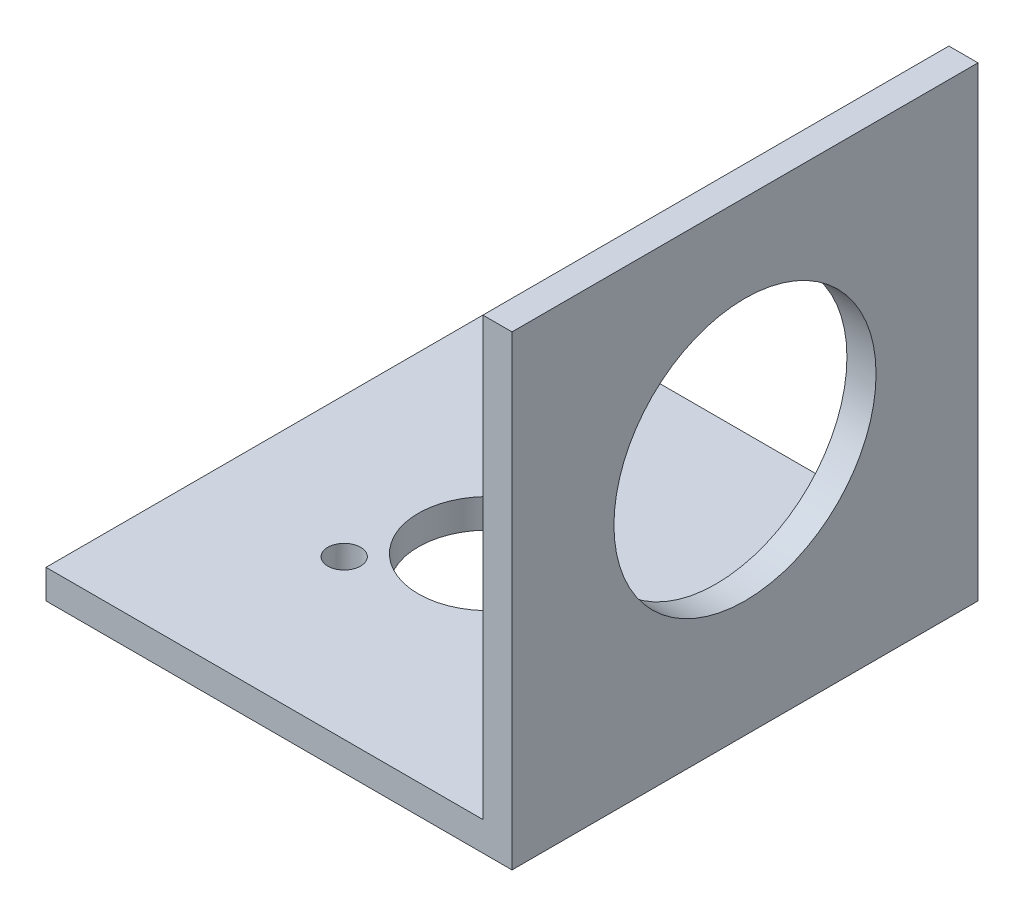
ISO-10303-21;
HEADER;
FILE_DESCRIPTION(('STEP AP214'),'2;1');
FILE_NAME('part.step','',(''),(''),'','','');
FILE_SCHEMA(('AUTOMOTIVE_DESIGN { 1 0 10303 214 1 1 1 1 }'));
ENDSEC;
DATA;
#1=APPLICATION_CONTEXT('core data for automotive mechanical design processes');
#2=APPLICATION_PROTOCOL_DEFINITION('international standard','automotive_design',2000,#1);
#3=PRODUCT_CONTEXT('',#1,'mechanical');
#4=PRODUCT('Part','Part','',(#3));
#5=PRODUCT_RELATED_PRODUCT_CATEGORY('part','',(#4));
#6=PRODUCT_DEFINITION_FORMATION('','',#4);
#7=PRODUCT_DEFINITION_CONTEXT('part definition',#1,'design');
#8=PRODUCT_DEFINITION('design','',#6,#7);
#9=PRODUCT_DEFINITION_SHAPE('','',#8);
#10=(LENGTH_UNIT() NAMED_UNIT(*) SI_UNIT(.MILLI.,.METRE.));
#11=(NAMED_UNIT(*) PLANE_ANGLE_UNIT() SI_UNIT($,.RADIAN.));
#12=(NAMED_UNIT(*) SI_UNIT($,.STERADIAN.) SOLID_ANGLE_UNIT());
#13=UNCERTAINTY_MEASURE_WITH_UNIT(LENGTH_MEASURE(1.E-05),#10,'distance_accuracy_value','');
#14=(GEOMETRIC_REPRESENTATION_CONTEXT(3) GLOBAL_UNCERTAINTY_ASSIGNED_CONTEXT((#13)) GLOBAL_UNIT_ASSIGNED_CONTEXT((#10,
#11,#12)) REPRESENTATION_CONTEXT('',''));
#15=CARTESIAN_POINT('',(0.,0.,0.));
#16=DIRECTION('',(0.,0.,1.));
#17=DIRECTION('',(1.,0.,0.));
#18=AXIS2_PLACEMENT_3D('',#15,#16,#17);
#19=CARTESIAN_POINT('',(47.625,0.,50.8));
#20=DIRECTION('',(-1.,0.,0.));
#21=DIRECTION('',(0.,0.,1.));
#22=AXIS2_PLACEMENT_3D('',#19,#20,#21);
#23=PLANE('',#22);
#24=CARTESIAN_POINT('',(47.625,26.9875,25.4));
#25=DIRECTION('',(-1.,0.,0.));
#26=DIRECTION('',(0.,0.,1.));
#27=AXIS2_PLACEMENT_3D('',#24,#25,#26);
#28=CIRCLE('',#27,14.2875);
#29=CARTESIAN_POINT('',(47.625,26.9875,39.6875));
#30=VERTEX_POINT('',#29);
#31=EDGE_CURVE('E157',#30,#30,#28,.T.);
#32=ORIENTED_EDGE('',*,*,#31,.F.);
#33=EDGE_LOOP('',(#32));
#34=FACE_BOUND('',#33,.T.);
#35=DIRECTION('',(0.,1.,0.));
#36=VECTOR('',#35,1.);
#37=CARTESIAN_POINT('',(47.625,0.,0.));
#38=LINE('',#37,#36);
#39=CARTESIAN_POINT('',(47.625,3.175,0.));
#40=VERTEX_POINT('',#39);
#41=CARTESIAN_POINT('',(47.625,50.8,0.));
#42=VERTEX_POINT('',#41);
#43=EDGE_CURVE('E127',#40,#42,#38,.T.);
#44=ORIENTED_EDGE('',*,*,#43,.F.);
#45=DIRECTION('',(0.,0.,-1.));
#46=VECTOR('',#45,1.);
#47=CARTESIAN_POINT('',(47.625,3.175,50.8));
#48=LINE('',#47,#46);
#49=CARTESIAN_POINT('',(47.625,3.175,50.8));
#50=VERTEX_POINT('',#49);
#51=EDGE_CURVE('E11',#50,#40,#48,.T.);
#52=ORIENTED_EDGE('',*,*,#51,.F.);
#53=DIRECTION('',(0.,1.,0.));
#54=VECTOR('',#53,1.);
#55=CARTESIAN_POINT('',(47.625,0.,50.8));
#56=LINE('',#55,#54);
#57=CARTESIAN_POINT('',(47.625,50.8,50.8));
#58=VERTEX_POINT('',#57);
#59=EDGE_CURVE('E147',#50,#58,#56,.T.);
#60=ORIENTED_EDGE('',*,*,#59,.T.);
#61=DIRECTION('',(0.,0.,-1.));
#62=VECTOR('',#61,1.);
#63=CARTESIAN_POINT('',(47.625,50.8,50.8));
#64=LINE('',#63,#62);
#65=EDGE_CURVE('E87',#58,#42,#64,.T.);
#66=ORIENTED_EDGE('',*,*,#65,.T.);
#67=EDGE_LOOP('',(#44,#52,#60,#66));
#68=FACE_BOUND('',#67,.T.);
#69=ADVANCED_FACE('F39',(#34,#68),#23,.T.);
#70=CARTESIAN_POINT('',(0.,3.175,50.8));
#71=DIRECTION('',(0.,1.,0.));
#72=DIRECTION('',(0.,0.,1.));
#73=AXIS2_PLACEMENT_3D('',#70,#71,#72);
#74=PLANE('',#73);
#75=CARTESIAN_POINT('',(15.2503914735228,3.175,33.5456779895878));
#76=DIRECTION('',(0.,1.,0.));
#77=DIRECTION('',(0.,0.,1.));
#78=AXIS2_PLACEMENT_3D('',#75,#76,#77);
#79=CIRCLE('',#78,1.7859375);
#80=CARTESIAN_POINT('',(15.2503914735228,3.175,31.7597404895878));
#81=VERTEX_POINT('',#80);
#82=EDGE_CURVE('E235',#81,#81,#79,.T.);
#83=ORIENTED_EDGE('',*,*,#82,.F.);
#84=EDGE_LOOP('',(#83));
#85=FACE_BOUND('',#84,.T.);
#86=CARTESIAN_POINT('',(19.5342401932077,3.175,14.7810407989345));
#87=DIRECTION('',(0.,1.,0.));
#88=DIRECTION('',(0.,0.,1.));
#89=AXIS2_PLACEMENT_3D('',#86,#87,#88);
#90=CIRCLE('',#89,1.7859375);
#91=CARTESIAN_POINT('',(19.5342401932077,3.175,12.9951032989344));
#92=VERTEX_POINT('',#91);
#93=EDGE_CURVE('E247',#92,#92,#90,.T.);
#94=ORIENTED_EDGE('',*,*,#93,.F.);
#95=EDGE_LOOP('',(#94));
#96=FACE_BOUND('',#95,.T.);
#97=CARTESIAN_POINT('',(33.6429683332694,3.175,27.8732812114778));
#98=DIRECTION('',(0.,1.,0.));
#99=DIRECTION('',(0.,0.,1.));
#100=AXIS2_PLACEMENT_3D('',#97,#98,#99);
#101=CIRCLE('',#100,1.7859375);
#102=CARTESIAN_POINT('',(33.6429683332694,3.175,26.0873437114778));
#103=VERTEX_POINT('',#102);
#104=EDGE_CURVE('E240',#103,#103,#101,.T.);
#105=ORIENTED_EDGE('',*,*,#104,.F.);
#106=EDGE_LOOP('',(#105));
#107=FACE_BOUND('',#106,.T.);
#108=CARTESIAN_POINT('',(22.8092,3.175,25.4));
#109=DIRECTION('',(0.,1.,0.));
#110=DIRECTION('',(0.,0.,1.));
#111=AXIS2_PLACEMENT_3D('',#108,#109,#110);
#112=CIRCLE('',#111,7.62);
#113=CARTESIAN_POINT('',(22.8092,3.175,33.02));
#114=VERTEX_POINT('',#113);
#115=EDGE_CURVE('E169',#114,#114,#112,.T.);
#116=ORIENTED_EDGE('',*,*,#115,.F.);
#117=EDGE_LOOP('',(#116));
#118=FACE_BOUND('',#117,.T.);
#119=DIRECTION('',(1.,0.,0.));
#120=VECTOR('',#119,1.);
#121=CARTESIAN_POINT('',(0.,3.175,0.));
#122=LINE('',#121,#120);
#123=CARTESIAN_POINT('',(0.,3.175,0.));
#124=VERTEX_POINT('',#123);
#125=EDGE_CURVE('E131',#124,#40,#122,.T.);
#126=ORIENTED_EDGE('',*,*,#125,.F.);
#127=DIRECTION('',(0.,0.,-1.));
#128=VECTOR('',#127,1.);
#129=CARTESIAN_POINT('',(0.,3.175,50.8));
#130=LINE('',#129,#128);
#131=CARTESIAN_POINT('',(0.,3.175,50.8));
#132=VERTEX_POINT('',#131);
#133=EDGE_CURVE('E49',#132,#124,#130,.T.);
#134=ORIENTED_EDGE('',*,*,#133,.F.);
#135=DIRECTION('',(1.,0.,0.));
#136=VECTOR('',#135,1.);
#137=CARTESIAN_POINT('',(0.,3.175,50.8));
#138=LINE('',#137,#136);
#139=EDGE_CURVE('E175',#132,#50,#138,.T.);
#140=ORIENTED_EDGE('',*,*,#139,.T.);
#141=ORIENTED_EDGE('',*,*,#51,.T.);
#142=EDGE_LOOP('',(#126,#134,#140,#141));
#143=FACE_BOUND('',#142,.T.);
#144=ADVANCED_FACE('F190',(#85,#96,#107,#118,#143),#74,.T.);
#145=CARTESIAN_POINT('',(0.,0.,50.8));
#146=DIRECTION('',(-1.,0.,0.));
#147=DIRECTION('',(0.,0.,1.));
#148=AXIS2_PLACEMENT_3D('',#145,#146,#147);
#149=PLANE('',#148);
#150=DIRECTION('',(0.,1.,0.));
#151=VECTOR('',#150,1.);
#152=CARTESIAN_POINT('',(0.,0.,0.));
#153=LINE('',#152,#151);
#154=CARTESIAN_POINT('',(0.,0.,0.));
#155=VERTEX_POINT('',#154);
#156=EDGE_CURVE('E136',#155,#124,#153,.T.);
#157=ORIENTED_EDGE('',*,*,#156,.F.);
#158=DIRECTION('',(0.,0.,-1.));
#159=VECTOR('',#158,1.);
#160=CARTESIAN_POINT('',(0.,0.,50.8));
#161=LINE('',#160,#159);
#162=CARTESIAN_POINT('',(0.,0.,50.8));
#163=VERTEX_POINT('',#162);
#164=EDGE_CURVE('E116',#163,#155,#161,.T.);
#165=ORIENTED_EDGE('',*,*,#164,.F.);
#166=DIRECTION('',(0.,1.,0.));
#167=VECTOR('',#166,1.);
#168=CARTESIAN_POINT('',(0.,0.,50.8));
#169=LINE('',#168,#167);
#170=EDGE_CURVE('E107',#163,#132,#169,.T.);
#171=ORIENTED_EDGE('',*,*,#170,.T.);
#172=ORIENTED_EDGE('',*,*,#133,.T.);
#173=EDGE_LOOP('',(#157,#165,#171,#172));
#174=FACE_BOUND('',#173,.T.);
#175=ADVANCED_FACE('F182',(#174),#149,.T.);
#176=CARTESIAN_POINT('',(0.,0.,50.8));
#177=DIRECTION('',(0.,1.,0.));
#178=DIRECTION('',(0.,0.,1.));
#179=AXIS2_PLACEMENT_3D('',#176,#177,#178);
#180=PLANE('',#179);
#181=CARTESIAN_POINT('',(15.2503914735228,0.,33.5456779895878));
#182=DIRECTION('',(0.,-1.,0.));
#183=DIRECTION('',(0.,0.,-1.));
#184=AXIS2_PLACEMENT_3D('',#181,#182,#183);
#185=CIRCLE('',#184,1.7859375);
#186=CARTESIAN_POINT('',(15.2503914735228,0.,31.7597404895878));
#187=VERTEX_POINT('',#186);
#188=EDGE_CURVE('E238',#187,#187,#185,.T.);
#189=ORIENTED_EDGE('',*,*,#188,.F.);
#190=EDGE_LOOP('',(#189));
#191=FACE_BOUND('',#190,.T.);
#192=CARTESIAN_POINT('',(19.5342401932077,0.,14.7810407989345));
#193=DIRECTION('',(0.,-1.,0.));
#194=DIRECTION('',(0.,0.,-1.));
#195=AXIS2_PLACEMENT_3D('',#192,#193,#194);
#196=CIRCLE('',#195,1.7859375);
#197=CARTESIAN_POINT('',(19.5342401932077,0.,12.9951032989344));
#198=VERTEX_POINT('',#197);
#199=EDGE_CURVE('E241',#198,#198,#196,.T.);
#200=ORIENTED_EDGE('',*,*,#199,.F.);
#201=EDGE_LOOP('',(#200));
#202=FACE_BOUND('',#201,.T.);
#203=CARTESIAN_POINT('',(33.6429683332694,0.,27.8732812114778));
#204=DIRECTION('',(0.,-1.,0.));
#205=DIRECTION('',(0.,0.,-1.));
#206=AXIS2_PLACEMENT_3D('',#203,#204,#205);
#207=CIRCLE('',#206,1.7859375);
#208=CARTESIAN_POINT('',(33.6429683332694,0.,26.0873437114778));
#209=VERTEX_POINT('',#208);
#210=EDGE_CURVE('E250',#209,#209,#207,.T.);
#211=ORIENTED_EDGE('',*,*,#210,.F.);
#212=EDGE_LOOP('',(#211));
#213=FACE_BOUND('',#212,.T.);
#214=CARTESIAN_POINT('',(22.8092,0.,25.4));
#215=DIRECTION('',(0.,1.,0.));
#216=DIRECTION('',(0.,0.,1.));
#217=AXIS2_PLACEMENT_3D('',#214,#215,#216);
#218=CIRCLE('',#217,7.62);
#219=CARTESIAN_POINT('',(22.8092,0.,33.02));
#220=VERTEX_POINT('',#219);
#221=EDGE_CURVE('E42',#220,#220,#218,.T.);
#222=ORIENTED_EDGE('',*,*,#221,.T.);
#223=EDGE_LOOP('',(#222));
#224=FACE_BOUND('',#223,.T.);
#225=DIRECTION('',(1.,0.,0.));
#226=VECTOR('',#225,1.);
#227=CARTESIAN_POINT('',(0.,0.,0.));
#228=LINE('',#227,#226);
#229=CARTESIAN_POINT('',(50.8,0.,0.));
#230=VERTEX_POINT('',#229);
#231=EDGE_CURVE('E114',#155,#230,#228,.T.);
#232=ORIENTED_EDGE('',*,*,#231,.T.);
#233=DIRECTION('',(0.,0.,-1.));
#234=VECTOR('',#233,1.);
#235=CARTESIAN_POINT('',(50.8,0.,50.8));
#236=LINE('',#235,#234);
#237=CARTESIAN_POINT('',(50.8,0.,50.8));
#238=VERTEX_POINT('',#237);
#239=EDGE_CURVE('E111',#238,#230,#236,.T.);
#240=ORIENTED_EDGE('',*,*,#239,.F.);
#241=DIRECTION('',(1.,0.,0.));
#242=VECTOR('',#241,1.);
#243=CARTESIAN_POINT('',(0.,0.,50.8));
#244=LINE('',#243,#242);
#245=EDGE_CURVE('E100',#163,#238,#244,.T.);
#246=ORIENTED_EDGE('',*,*,#245,.F.);
#247=ORIENTED_EDGE('',*,*,#164,.T.);
#248=EDGE_LOOP('',(#232,#240,#246,#247));
#249=FACE_BOUND('',#248,.T.);
#250=ADVANCED_FACE('F112',(#191,#202,#213,#224,#249),#180,.F.);
#251=CARTESIAN_POINT('',(50.8,0.,50.8));
#252=DIRECTION('',(-1.,0.,0.));
#253=DIRECTION('',(0.,0.,1.));
#254=AXIS2_PLACEMENT_3D('',#251,#252,#253);
#255=PLANE('',#254);
#256=CARTESIAN_POINT('',(50.8,26.9875,25.4));
#257=DIRECTION('',(-1.,0.,0.));
#258=DIRECTION('',(0.,0.,1.));
#259=AXIS2_PLACEMENT_3D('',#256,#257,#258);
#260=CIRCLE('',#259,14.2875);
#261=CARTESIAN_POINT('',(50.8,26.9875,39.6875));
#262=VERTEX_POINT('',#261);
#263=EDGE_CURVE('E132',#262,#262,#260,.T.);
#264=ORIENTED_EDGE('',*,*,#263,.T.);
#265=EDGE_LOOP('',(#264));
#266=FACE_BOUND('',#265,.T.);
#267=DIRECTION('',(0.,1.,0.));
#268=VECTOR('',#267,1.);
#269=CARTESIAN_POINT('',(50.8,0.,0.));
#270=LINE('',#269,#268);
#271=CARTESIAN_POINT('',(50.8,50.8,0.));
#272=VERTEX_POINT('',#271);
#273=EDGE_CURVE('E80',#230,#272,#270,.T.);
#274=ORIENTED_EDGE('',*,*,#273,.T.);
#275=DIRECTION('',(0.,0.,-1.));
#276=VECTOR('',#275,1.);
#277=CARTESIAN_POINT('',(50.8,50.8,50.8));
#278=LINE('',#277,#276);
#279=CARTESIAN_POINT('',(50.8,50.8,50.8));
#280=VERTEX_POINT('',#279);
#281=EDGE_CURVE('E117',#280,#272,#278,.T.);
#282=ORIENTED_EDGE('',*,*,#281,.F.);
#283=DIRECTION('',(0.,1.,0.));
#284=VECTOR('',#283,1.);
#285=CARTESIAN_POINT('',(50.8,0.,50.8));
#286=LINE('',#285,#284);
#287=EDGE_CURVE('E104',#238,#280,#286,.T.);
#288=ORIENTED_EDGE('',*,*,#287,.F.);
#289=ORIENTED_EDGE('',*,*,#239,.T.);
#290=EDGE_LOOP('',(#274,#282,#288,#289));
#291=FACE_BOUND('',#290,.T.);
#292=ADVANCED_FACE('F119',(#266,#291),#255,.F.);
#293=CARTESIAN_POINT('',(1.11022302462516E-13,50.8000000000001,50.8));
#294=DIRECTION('',(0.,-1.,0.));
#295=DIRECTION('',(1.,0.,0.));
#296=AXIS2_PLACEMENT_3D('',#293,#294,#295);
#297=PLANE('',#296);
#298=DIRECTION('',(-1.,0.,0.));
#299=VECTOR('',#298,1.);
#300=CARTESIAN_POINT('',(1.11022302462516E-13,50.8000000000001,0.));
#301=LINE('',#300,#299);
#302=EDGE_CURVE('E144',#272,#42,#301,.T.);
#303=ORIENTED_EDGE('',*,*,#302,.T.);
#304=ORIENTED_EDGE('',*,*,#65,.F.);
#305=DIRECTION('',(-1.,0.,0.));
#306=VECTOR('',#305,1.);
#307=CARTESIAN_POINT('',(1.11022302462516E-13,50.8000000000001,50.8));
#308=LINE('',#307,#306);
#309=EDGE_CURVE('E58',#280,#58,#308,.T.);
#310=ORIENTED_EDGE('',*,*,#309,.F.);
#311=ORIENTED_EDGE('',*,*,#281,.T.);
#312=EDGE_LOOP('',(#303,#304,#310,#311));
#313=FACE_BOUND('',#312,.T.);
#314=ADVANCED_FACE('F188',(#313),#297,.F.);
#315=CARTESIAN_POINT('',(0.,0.,50.8));
#316=DIRECTION('',(0.,0.,1.));
#317=DIRECTION('',(1.,0.,0.));
#318=AXIS2_PLACEMENT_3D('',#315,#316,#317);
#319=PLANE('',#318);
#320=ORIENTED_EDGE('',*,*,#59,.F.);
#321=ORIENTED_EDGE('',*,*,#139,.F.);
#322=ORIENTED_EDGE('',*,*,#170,.F.);
#323=ORIENTED_EDGE('',*,*,#245,.T.);
#324=ORIENTED_EDGE('',*,*,#287,.T.);
#325=ORIENTED_EDGE('',*,*,#309,.T.);
#326=EDGE_LOOP('',(#320,#321,#322,#323,#324,#325));
#327=FACE_BOUND('',#326,.T.);
#328=ADVANCED_FACE('F102',(#327),#319,.T.);
#329=CARTESIAN_POINT('',(0.,0.,0.));
#330=DIRECTION('',(0.,0.,1.));
#331=DIRECTION('',(1.,0.,0.));
#332=AXIS2_PLACEMENT_3D('',#329,#330,#331);
#333=PLANE('',#332);
#334=ORIENTED_EDGE('',*,*,#43,.T.);
#335=ORIENTED_EDGE('',*,*,#302,.F.);
#336=ORIENTED_EDGE('',*,*,#273,.F.);
#337=ORIENTED_EDGE('',*,*,#231,.F.);
#338=ORIENTED_EDGE('',*,*,#156,.T.);
#339=ORIENTED_EDGE('',*,*,#125,.T.);
#340=EDGE_LOOP('',(#334,#335,#336,#337,#338,#339));
#341=FACE_BOUND('',#340,.T.);
#342=ADVANCED_FACE('F185',(#341),#333,.F.);
#343=CARTESIAN_POINT('',(98.425,26.9875,25.4));
#344=DIRECTION('',(-1.,0.,0.));
#345=DIRECTION('',(0.,0.,1.));
#346=AXIS2_PLACEMENT_3D('',#343,#344,#345);
#347=CYLINDRICAL_SURFACE('',#346,14.2875);
#348=ORIENTED_EDGE('',*,*,#31,.T.);
#349=EDGE_LOOP('',(#348));
#350=FACE_BOUND('',#349,.T.);
#351=ORIENTED_EDGE('',*,*,#263,.F.);
#352=EDGE_LOOP('',(#351));
#353=FACE_BOUND('',#352,.T.);
#354=ADVANCED_FACE('F211',(#350,#353),#347,.F.);
#355=CARTESIAN_POINT('',(22.8092,-47.625,25.4));
#356=DIRECTION('',(0.,1.,0.));
#357=DIRECTION('',(0.,0.,1.));
#358=AXIS2_PLACEMENT_3D('',#355,#356,#357);
#359=CYLINDRICAL_SURFACE('',#358,7.62);
#360=ORIENTED_EDGE('',*,*,#115,.T.);
#361=EDGE_LOOP('',(#360));
#362=FACE_BOUND('',#361,.T.);
#363=ORIENTED_EDGE('',*,*,#221,.F.);
#364=EDGE_LOOP('',(#363));
#365=FACE_BOUND('',#364,.T.);
#366=ADVANCED_FACE('F216',(#362,#365),#359,.F.);
#367=CARTESIAN_POINT('',(33.6429683332694,12.7,27.8732812114778));
#368=DIRECTION('',(0.,-1.,0.));
#369=DIRECTION('',(0.,0.,-1.));
#370=AXIS2_PLACEMENT_3D('',#367,#368,#369);
#371=CYLINDRICAL_SURFACE('',#370,1.7859375);
#372=CARTESIAN_POINT('',(33.6429683332694,3.175,26.0873437114778));
#373=CARTESIAN_POINT('',(33.6429683332694,3.14192708333333,26.0873437114778));
#374=CARTESIAN_POINT('',(33.6429683332694,3.10885416666666,26.0873437114778));
#375=CARTESIAN_POINT('',(33.6429683332694,3.04270833333333,26.0873437114778));
#376=CARTESIAN_POINT('',(33.6429683332694,3.00963541666667,26.0873437114778));
#377=CARTESIAN_POINT('',(33.6429683332694,2.94348958333333,26.0873437114778));
#378=CARTESIAN_POINT('',(33.6429683332694,2.91041666666666,26.0873437114778));
#379=CARTESIAN_POINT('',(33.6429683332694,2.84427083333333,26.0873437114778));
#380=CARTESIAN_POINT('',(33.6429683332694,2.81119791666666,26.0873437114778));
#381=CARTESIAN_POINT('',(33.6429683332694,2.74505208333333,26.0873437114778));
#382=CARTESIAN_POINT('',(33.6429683332694,2.71197916666666,26.0873437114778));
#383=CARTESIAN_POINT('',(33.6429683332694,2.64583333333333,26.0873437114778));
#384=CARTESIAN_POINT('',(33.6429683332694,2.61276041666666,26.0873437114778));
#385=CARTESIAN_POINT('',(33.6429683332694,2.54661458333333,26.0873437114778));
#386=CARTESIAN_POINT('',(33.6429683332694,2.51354166666666,26.0873437114778));
#387=CARTESIAN_POINT('',(33.6429683332694,2.44739583333333,26.0873437114778));
#388=CARTESIAN_POINT('',(33.6429683332694,2.41432291666666,26.0873437114778));
#389=CARTESIAN_POINT('',(33.6429683332694,2.34817708333333,26.0873437114778));
#390=CARTESIAN_POINT('',(33.6429683332694,2.31510416666667,26.0873437114778));
#391=CARTESIAN_POINT('',(33.6429683332694,2.24895833333333,26.0873437114778));
#392=CARTESIAN_POINT('',(33.6429683332694,2.21588541666667,26.0873437114778));
#393=CARTESIAN_POINT('',(33.6429683332694,2.14973958333333,26.0873437114778));
#394=CARTESIAN_POINT('',(33.6429683332694,2.11666666666666,26.0873437114778));
#395=CARTESIAN_POINT('',(33.6429683332694,2.05052083333333,26.0873437114778));
#396=CARTESIAN_POINT('',(33.6429683332694,2.01744791666667,26.0873437114778));
#397=CARTESIAN_POINT('',(33.6429683332694,1.95130208333333,26.0873437114778));
#398=CARTESIAN_POINT('',(33.6429683332694,1.91822916666667,26.0873437114778));
#399=CARTESIAN_POINT('',(33.6429683332694,1.85208333333333,26.0873437114778));
#400=CARTESIAN_POINT('',(33.6429683332694,1.81901041666666,26.0873437114778));
#401=CARTESIAN_POINT('',(33.6429683332694,1.75286458333333,26.0873437114778));
#402=CARTESIAN_POINT('',(33.6429683332694,1.71979166666666,26.0873437114778));
#403=CARTESIAN_POINT('',(33.6429683332694,1.65364583333333,26.0873437114778));
#404=CARTESIAN_POINT('',(33.6429683332694,1.62057291666667,26.0873437114778));
#405=CARTESIAN_POINT('',(33.6429683332694,1.55442708333333,26.0873437114778));
#406=CARTESIAN_POINT('',(33.6429683332694,1.52135416666667,26.0873437114778));
#407=CARTESIAN_POINT('',(33.6429683332694,1.45520833333333,26.0873437114778));
#408=CARTESIAN_POINT('',(33.6429683332694,1.42213541666667,26.0873437114778));
#409=CARTESIAN_POINT('',(33.6429683332694,1.35598958333333,26.0873437114778));
#410=CARTESIAN_POINT('',(33.6429683332694,1.32291666666667,26.0873437114778));
#411=CARTESIAN_POINT('',(33.6429683332694,1.25677083333333,26.0873437114778));
#412=CARTESIAN_POINT('',(33.6429683332694,1.22369791666667,26.0873437114778));
#413=CARTESIAN_POINT('',(33.6429683332694,1.15755208333333,26.0873437114778));
#414=CARTESIAN_POINT('',(33.6429683332694,1.12447916666667,26.0873437114778));
#415=CARTESIAN_POINT('',(33.6429683332694,1.05833333333333,26.0873437114778));
#416=CARTESIAN_POINT('',(33.6429683332694,1.02526041666667,26.0873437114778));
#417=CARTESIAN_POINT('',(33.6429683332694,0.959114583333332,26.0873437114778));
#418=CARTESIAN_POINT('',(33.6429683332694,0.926041666666665,26.0873437114778));
#419=CARTESIAN_POINT('',(33.6429683332694,0.859895833333332,26.0873437114778));
#420=CARTESIAN_POINT('',(33.6429683332694,0.826822916666666,26.0873437114778));
#421=CARTESIAN_POINT('',(33.6429683332694,0.760677083333333,26.0873437114778));
#422=CARTESIAN_POINT('',(33.6429683332694,0.727604166666666,26.0873437114778));
#423=CARTESIAN_POINT('',(33.6429683332694,0.661458333333333,26.0873437114778));
#424=CARTESIAN_POINT('',(33.6429683332694,0.628385416666667,26.0873437114778));
#425=CARTESIAN_POINT('',(33.6429683332694,0.562239583333333,26.0873437114778));
#426=CARTESIAN_POINT('',(33.6429683332694,0.529166666666666,26.0873437114778));
#427=CARTESIAN_POINT('',(33.6429683332694,0.463020833333333,26.0873437114778));
#428=CARTESIAN_POINT('',(33.6429683332694,0.429947916666666,26.0873437114778));
#429=CARTESIAN_POINT('',(33.6429683332694,0.363802083333333,26.0873437114778));
#430=CARTESIAN_POINT('',(33.6429683332694,0.330729166666667,26.0873437114778));
#431=CARTESIAN_POINT('',(33.6429683332694,0.264583333333333,26.0873437114778));
#432=CARTESIAN_POINT('',(33.6429683332694,0.231510416666666,26.0873437114778));
#433=CARTESIAN_POINT('',(33.6429683332694,0.165364583333332,26.0873437114778));
#434=CARTESIAN_POINT('',(33.6429683332694,0.132291666666666,26.0873437114778));
#435=CARTESIAN_POINT('',(33.6429683332694,0.066145833333333,26.0873437114778));
#436=CARTESIAN_POINT('',(33.6429683332694,0.0330729166666665,26.0873437114778));
#437=CARTESIAN_POINT('',(33.6429683332694,0.,26.0873437114778));
#438=B_SPLINE_CURVE_WITH_KNOTS('',3,(#372,#373,#374,#375,#376,#377,#378,#379,#380,#381,#382,
#383,#384,#385,#386,#387,#388,#389,#390,#391,#392,#393,#394,#395,#396,#397,#398,#399,#400,#401,
#402,#403,#404,#405,#406,#407,#408,#409,#410,#411,#412,#413,#414,#415,#416,#417,#418,#419,#420,
#421,#422,#423,#424,#425,#426,#427,#428,#429,#430,#431,#432,#433,#434,#435,#436,#437),
.UNSPECIFIED.,.F.,.F.,(4,2,2,2,2,2,2,2,2,2,2,2,2,2,2,2,2,2,2,2,2,2,2,2,2,2,2,2,2,2,2,2,4),(0.,
0.0992187499999995,0.198437499999999,0.29765625,0.396875,0.496093749999999,0.5953125,0.69453125,
0.793749999999999,0.892968749999999,0.992187499999998,1.09140625,1.190625,1.28984375,1.3890625,
1.48828125,1.5875,1.68671875,1.7859375,1.88515625,1.984375,2.08359375,2.1828125,2.28203125,
2.38125,2.48046875,2.5796875,2.67890625,2.778125,2.87734375,2.9765625,3.07578125,3.175),.UNSPECIFIED.);
#439=EDGE_CURVE('BSEAM219',#103,#209,#438,.T.);
#440=ORIENTED_EDGE('',*,*,#104,.T.);
#441=ORIENTED_EDGE('',*,*,#210,.T.);
#442=ORIENTED_EDGE('',*,*,#439,.T.);
#443=ORIENTED_EDGE('',*,*,#439,.F.);
#444=EDGE_LOOP('',(#440,#442,#441,#443));
#445=FACE_BOUND('',#444,.T.);
#446=ADVANCED_FACE('F219',(#445),#371,.F.);
#447=CARTESIAN_POINT('',(19.5342401932077,12.7,14.7810407989345));
#448=DIRECTION('',(0.,-1.,0.));
#449=DIRECTION('',(0.,0.,-1.));
#450=AXIS2_PLACEMENT_3D('',#447,#448,#449);
#451=CYLINDRICAL_SURFACE('',#450,1.7859375);
#452=CARTESIAN_POINT('',(19.5342401932077,3.175,12.9951032989344));
#453=CARTESIAN_POINT('',(19.5342401932077,3.14192708333333,12.9951032989344));
#454=CARTESIAN_POINT('',(19.5342401932077,3.10885416666666,12.9951032989344));
#455=CARTESIAN_POINT('',(19.5342401932077,3.04270833333333,12.9951032989344));
#456=CARTESIAN_POINT('',(19.5342401932077,3.00963541666667,12.9951032989344));
#457=CARTESIAN_POINT('',(19.5342401932077,2.94348958333333,12.9951032989344));
#458=CARTESIAN_POINT('',(19.5342401932077,2.91041666666666,12.9951032989344));
#459=CARTESIAN_POINT('',(19.5342401932077,2.84427083333333,12.9951032989344));
#460=CARTESIAN_POINT('',(19.5342401932077,2.81119791666666,12.9951032989344));
#461=CARTESIAN_POINT('',(19.5342401932077,2.74505208333333,12.9951032989344));
#462=CARTESIAN_POINT('',(19.5342401932077,2.71197916666666,12.9951032989344));
#463=CARTESIAN_POINT('',(19.5342401932077,2.64583333333333,12.9951032989344));
#464=CARTESIAN_POINT('',(19.5342401932077,2.61276041666666,12.9951032989344));
#465=CARTESIAN_POINT('',(19.5342401932077,2.54661458333333,12.9951032989344));
#466=CARTESIAN_POINT('',(19.5342401932077,2.51354166666666,12.9951032989344));
#467=CARTESIAN_POINT('',(19.5342401932077,2.44739583333333,12.9951032989344));
#468=CARTESIAN_POINT('',(19.5342401932077,2.41432291666666,12.9951032989344));
#469=CARTESIAN_POINT('',(19.5342401932077,2.34817708333333,12.9951032989344));
#470=CARTESIAN_POINT('',(19.5342401932077,2.31510416666667,12.9951032989344));
#471=CARTESIAN_POINT('',(19.5342401932077,2.24895833333333,12.9951032989344));
#472=CARTESIAN_POINT('',(19.5342401932077,2.21588541666667,12.9951032989344));
#473=CARTESIAN_POINT('',(19.5342401932077,2.14973958333333,12.9951032989344));
#474=CARTESIAN_POINT('',(19.5342401932077,2.11666666666666,12.9951032989344));
#475=CARTESIAN_POINT('',(19.5342401932077,2.05052083333333,12.9951032989344));
#476=CARTESIAN_POINT('',(19.5342401932077,2.01744791666667,12.9951032989344));
#477=CARTESIAN_POINT('',(19.5342401932077,1.95130208333333,12.9951032989344));
#478=CARTESIAN_POINT('',(19.5342401932077,1.91822916666667,12.9951032989344));
#479=CARTESIAN_POINT('',(19.5342401932077,1.85208333333333,12.9951032989344));
#480=CARTESIAN_POINT('',(19.5342401932077,1.81901041666666,12.9951032989344));
#481=CARTESIAN_POINT('',(19.5342401932077,1.75286458333333,12.9951032989344));
#482=CARTESIAN_POINT('',(19.5342401932077,1.71979166666666,12.9951032989344));
#483=CARTESIAN_POINT('',(19.5342401932077,1.65364583333333,12.9951032989344));
#484=CARTESIAN_POINT('',(19.5342401932077,1.62057291666667,12.9951032989344));
#485=CARTESIAN_POINT('',(19.5342401932077,1.55442708333333,12.9951032989344));
#486=CARTESIAN_POINT('',(19.5342401932077,1.52135416666667,12.9951032989344));
#487=CARTESIAN_POINT('',(19.5342401932077,1.45520833333333,12.9951032989344));
#488=CARTESIAN_POINT('',(19.5342401932077,1.42213541666667,12.9951032989344));
#489=CARTESIAN_POINT('',(19.5342401932077,1.35598958333333,12.9951032989344));
#490=CARTESIAN_POINT('',(19.5342401932077,1.32291666666667,12.9951032989344));
#491=CARTESIAN_POINT('',(19.5342401932077,1.25677083333333,12.9951032989344));
#492=CARTESIAN_POINT('',(19.5342401932077,1.22369791666667,12.9951032989344));
#493=CARTESIAN_POINT('',(19.5342401932077,1.15755208333333,12.9951032989344));
#494=CARTESIAN_POINT('',(19.5342401932077,1.12447916666667,12.9951032989344));
#495=CARTESIAN_POINT('',(19.5342401932077,1.05833333333333,12.9951032989344));
#496=CARTESIAN_POINT('',(19.5342401932077,1.02526041666667,12.9951032989344));
#497=CARTESIAN_POINT('',(19.5342401932077,0.959114583333332,12.9951032989344));
#498=CARTESIAN_POINT('',(19.5342401932077,0.926041666666665,12.9951032989344));
#499=CARTESIAN_POINT('',(19.5342401932077,0.859895833333332,12.9951032989344));
#500=CARTESIAN_POINT('',(19.5342401932077,0.826822916666666,12.9951032989344));
#501=CARTESIAN_POINT('',(19.5342401932077,0.760677083333333,12.9951032989344));
#502=CARTESIAN_POINT('',(19.5342401932077,0.727604166666666,12.9951032989344));
#503=CARTESIAN_POINT('',(19.5342401932077,0.661458333333333,12.9951032989344));
#504=CARTESIAN_POINT('',(19.5342401932077,0.628385416666667,12.9951032989344));
#505=CARTESIAN_POINT('',(19.5342401932077,0.562239583333333,12.9951032989344));
#506=CARTESIAN_POINT('',(19.5342401932077,0.529166666666666,12.9951032989344));
#507=CARTESIAN_POINT('',(19.5342401932077,0.463020833333333,12.9951032989344));
#508=CARTESIAN_POINT('',(19.5342401932077,0.429947916666666,12.9951032989344));
#509=CARTESIAN_POINT('',(19.5342401932077,0.363802083333333,12.9951032989344));
#510=CARTESIAN_POINT('',(19.5342401932077,0.330729166666667,12.9951032989344));
#511=CARTESIAN_POINT('',(19.5342401932077,0.264583333333333,12.9951032989344));
#512=CARTESIAN_POINT('',(19.5342401932077,0.231510416666666,12.9951032989344));
#513=CARTESIAN_POINT('',(19.5342401932077,0.165364583333332,12.9951032989344));
#514=CARTESIAN_POINT('',(19.5342401932077,0.132291666666666,12.9951032989344));
#515=CARTESIAN_POINT('',(19.5342401932077,0.066145833333333,12.9951032989344));
#516=CARTESIAN_POINT('',(19.5342401932077,0.0330729166666665,12.9951032989344));
#517=CARTESIAN_POINT('',(19.5342401932077,0.,12.9951032989344));
#518=B_SPLINE_CURVE_WITH_KNOTS('',3,(#452,#453,#454,#455,#456,#457,#458,#459,#460,#461,#462,
#463,#464,#465,#466,#467,#468,#469,#470,#471,#472,#473,#474,#475,#476,#477,#478,#479,#480,#481,
#482,#483,#484,#485,#486,#487,#488,#489,#490,#491,#492,#493,#494,#495,#496,#497,#498,#499,#500,
#501,#502,#503,#504,#505,#506,#507,#508,#509,#510,#511,#512,#513,#514,#515,#516,#517),
.UNSPECIFIED.,.F.,.F.,(4,2,2,2,2,2,2,2,2,2,2,2,2,2,2,2,2,2,2,2,2,2,2,2,2,2,2,2,2,2,2,2,4),(0.,
0.0992187499999995,0.198437499999999,0.29765625,0.396875,0.496093749999999,0.5953125,0.69453125,
0.793749999999999,0.892968749999999,0.992187499999998,1.09140625,1.190625,1.28984375,1.3890625,
1.48828125,1.5875,1.68671875,1.7859375,1.88515625,1.984375,2.08359375,2.1828125,2.28203125,
2.38125,2.48046875,2.5796875,2.67890625,2.778125,2.87734375,2.9765625,3.07578125,3.175),.UNSPECIFIED.);
#519=EDGE_CURVE('BSEAM223',#92,#198,#518,.T.);
#520=ORIENTED_EDGE('',*,*,#93,.T.);
#521=ORIENTED_EDGE('',*,*,#199,.T.);
#522=ORIENTED_EDGE('',*,*,#519,.T.);
#523=ORIENTED_EDGE('',*,*,#519,.F.);
#524=EDGE_LOOP('',(#520,#522,#521,#523));
#525=FACE_BOUND('',#524,.T.);
#526=ADVANCED_FACE('F223',(#525),#451,.F.);
#527=CARTESIAN_POINT('',(15.2503914735228,12.7,33.5456779895878));
#528=DIRECTION('',(0.,-1.,0.));
#529=DIRECTION('',(0.,0.,-1.));
#530=AXIS2_PLACEMENT_3D('',#527,#528,#529);
#531=CYLINDRICAL_SURFACE('',#530,1.7859375);
#532=CARTESIAN_POINT('',(15.2503914735228,3.175,31.7597404895878));
#533=CARTESIAN_POINT('',(15.2503914735228,3.14192708333333,31.7597404895878));
#534=CARTESIAN_POINT('',(15.2503914735228,3.10885416666666,31.7597404895878));
#535=CARTESIAN_POINT('',(15.2503914735228,3.04270833333333,31.7597404895878));
#536=CARTESIAN_POINT('',(15.2503914735228,3.00963541666667,31.7597404895878));
#537=CARTESIAN_POINT('',(15.2503914735228,2.94348958333333,31.7597404895878));
#538=CARTESIAN_POINT('',(15.2503914735228,2.91041666666666,31.7597404895878));
#539=CARTESIAN_POINT('',(15.2503914735228,2.84427083333333,31.7597404895878));
#540=CARTESIAN_POINT('',(15.2503914735228,2.81119791666666,31.7597404895878));
#541=CARTESIAN_POINT('',(15.2503914735228,2.74505208333333,31.7597404895878));
#542=CARTESIAN_POINT('',(15.2503914735228,2.71197916666666,31.7597404895878));
#543=CARTESIAN_POINT('',(15.2503914735228,2.64583333333333,31.7597404895878));
#544=CARTESIAN_POINT('',(15.2503914735228,2.61276041666666,31.7597404895878));
#545=CARTESIAN_POINT('',(15.2503914735228,2.54661458333333,31.7597404895878));
#546=CARTESIAN_POINT('',(15.2503914735228,2.51354166666666,31.7597404895878));
#547=CARTESIAN_POINT('',(15.2503914735228,2.44739583333333,31.7597404895878));
#548=CARTESIAN_POINT('',(15.2503914735228,2.41432291666666,31.7597404895878));
#549=CARTESIAN_POINT('',(15.2503914735228,2.34817708333333,31.7597404895878));
#550=CARTESIAN_POINT('',(15.2503914735228,2.31510416666667,31.7597404895878));
#551=CARTESIAN_POINT('',(15.2503914735228,2.24895833333333,31.7597404895878));
#552=CARTESIAN_POINT('',(15.2503914735228,2.21588541666667,31.7597404895878));
#553=CARTESIAN_POINT('',(15.2503914735228,2.14973958333333,31.7597404895878));
#554=CARTESIAN_POINT('',(15.2503914735228,2.11666666666666,31.7597404895878));
#555=CARTESIAN_POINT('',(15.2503914735228,2.05052083333333,31.7597404895878));
#556=CARTESIAN_POINT('',(15.2503914735228,2.01744791666667,31.7597404895878));
#557=CARTESIAN_POINT('',(15.2503914735228,1.95130208333333,31.7597404895878));
#558=CARTESIAN_POINT('',(15.2503914735228,1.91822916666667,31.7597404895878));
#559=CARTESIAN_POINT('',(15.2503914735228,1.85208333333333,31.7597404895878));
#560=CARTESIAN_POINT('',(15.2503914735228,1.81901041666666,31.7597404895878));
#561=CARTESIAN_POINT('',(15.2503914735228,1.75286458333333,31.7597404895878));
#562=CARTESIAN_POINT('',(15.2503914735228,1.71979166666666,31.7597404895878));
#563=CARTESIAN_POINT('',(15.2503914735228,1.65364583333333,31.7597404895878));
#564=CARTESIAN_POINT('',(15.2503914735228,1.62057291666667,31.7597404895878));
#565=CARTESIAN_POINT('',(15.2503914735228,1.55442708333333,31.7597404895878));
#566=CARTESIAN_POINT('',(15.2503914735228,1.52135416666667,31.7597404895878));
#567=CARTESIAN_POINT('',(15.2503914735228,1.45520833333333,31.7597404895878));
#568=CARTESIAN_POINT('',(15.2503914735228,1.42213541666667,31.7597404895878));
#569=CARTESIAN_POINT('',(15.2503914735228,1.35598958333333,31.7597404895878));
#570=CARTESIAN_POINT('',(15.2503914735228,1.32291666666667,31.7597404895878));
#571=CARTESIAN_POINT('',(15.2503914735228,1.25677083333333,31.7597404895878));
#572=CARTESIAN_POINT('',(15.2503914735228,1.22369791666667,31.7597404895878));
#573=CARTESIAN_POINT('',(15.2503914735228,1.15755208333333,31.7597404895878));
#574=CARTESIAN_POINT('',(15.2503914735228,1.12447916666667,31.7597404895878));
#575=CARTESIAN_POINT('',(15.2503914735228,1.05833333333333,31.7597404895878));
#576=CARTESIAN_POINT('',(15.2503914735228,1.02526041666667,31.7597404895878));
#577=CARTESIAN_POINT('',(15.2503914735228,0.959114583333332,31.7597404895878));
#578=CARTESIAN_POINT('',(15.2503914735228,0.926041666666665,31.7597404895878));
#579=CARTESIAN_POINT('',(15.2503914735228,0.859895833333332,31.7597404895878));
#580=CARTESIAN_POINT('',(15.2503914735228,0.826822916666666,31.7597404895878));
#581=CARTESIAN_POINT('',(15.2503914735228,0.760677083333333,31.7597404895878));
#582=CARTESIAN_POINT('',(15.2503914735228,0.727604166666666,31.7597404895878));
#583=CARTESIAN_POINT('',(15.2503914735228,0.661458333333333,31.7597404895878));
#584=CARTESIAN_POINT('',(15.2503914735228,0.628385416666667,31.7597404895878));
#585=CARTESIAN_POINT('',(15.2503914735228,0.562239583333333,31.7597404895878));
#586=CARTESIAN_POINT('',(15.2503914735228,0.529166666666666,31.7597404895878));
#587=CARTESIAN_POINT('',(15.2503914735228,0.463020833333333,31.7597404895878));
#588=CARTESIAN_POINT('',(15.2503914735228,0.429947916666666,31.7597404895878));
#589=CARTESIAN_POINT('',(15.2503914735228,0.363802083333333,31.7597404895878));
#590=CARTESIAN_POINT('',(15.2503914735228,0.330729166666667,31.7597404895878));
#591=CARTESIAN_POINT('',(15.2503914735228,0.264583333333333,31.7597404895878));
#592=CARTESIAN_POINT('',(15.2503914735228,0.231510416666666,31.7597404895878));
#593=CARTESIAN_POINT('',(15.2503914735228,0.165364583333332,31.7597404895878));
#594=CARTESIAN_POINT('',(15.2503914735228,0.132291666666666,31.7597404895878));
#595=CARTESIAN_POINT('',(15.2503914735228,0.066145833333333,31.7597404895878));
#596=CARTESIAN_POINT('',(15.2503914735228,0.0330729166666665,31.7597404895878));
#597=CARTESIAN_POINT('',(15.2503914735228,0.,31.7597404895878));
#598=B_SPLINE_CURVE_WITH_KNOTS('',3,(#532,#533,#534,#535,#536,#537,#538,#539,#540,#541,#542,
#543,#544,#545,#546,#547,#548,#549,#550,#551,#552,#553,#554,#555,#556,#557,#558,#559,#560,#561,
#562,#563,#564,#565,#566,#567,#568,#569,#570,#571,#572,#573,#574,#575,#576,#577,#578,#579,#580,
#581,#582,#583,#584,#585,#586,#587,#588,#589,#590,#591,#592,#593,#594,#595,#596,#597),
.UNSPECIFIED.,.F.,.F.,(4,2,2,2,2,2,2,2,2,2,2,2,2,2,2,2,2,2,2,2,2,2,2,2,2,2,2,2,2,2,2,2,4),(0.,
0.0992187499999995,0.198437499999999,0.29765625,0.396875,0.496093749999999,0.5953125,0.69453125,
0.793749999999999,0.892968749999999,0.992187499999998,1.09140625,1.190625,1.28984375,1.3890625,
1.48828125,1.5875,1.68671875,1.7859375,1.88515625,1.984375,2.08359375,2.1828125,2.28203125,
2.38125,2.48046875,2.5796875,2.67890625,2.778125,2.87734375,2.9765625,3.07578125,3.175),.UNSPECIFIED.);
#599=EDGE_CURVE('BSEAM227',#81,#187,#598,.T.);
#600=ORIENTED_EDGE('',*,*,#82,.T.);
#601=ORIENTED_EDGE('',*,*,#188,.T.);
#602=ORIENTED_EDGE('',*,*,#599,.T.);
#603=ORIENTED_EDGE('',*,*,#599,.F.);
#604=EDGE_LOOP('',(#600,#602,#601,#603));
#605=FACE_BOUND('',#604,.T.);
#606=ADVANCED_FACE('F227',(#605),#531,.F.);
#607=CLOSED_SHELL('',(#69,#144,#175,#250,#292,#314,#328,#342,#354,#366,#446,#526,#606));
#608=MANIFOLD_SOLID_BREP('B2',#607);
#609=ADVANCED_BREP_SHAPE_REPRESENTATION('',(#18,#608),#14);
#610=SHAPE_DEFINITION_REPRESENTATION(#9,#609);
ENDSEC;
END-ISO-10303-21;
